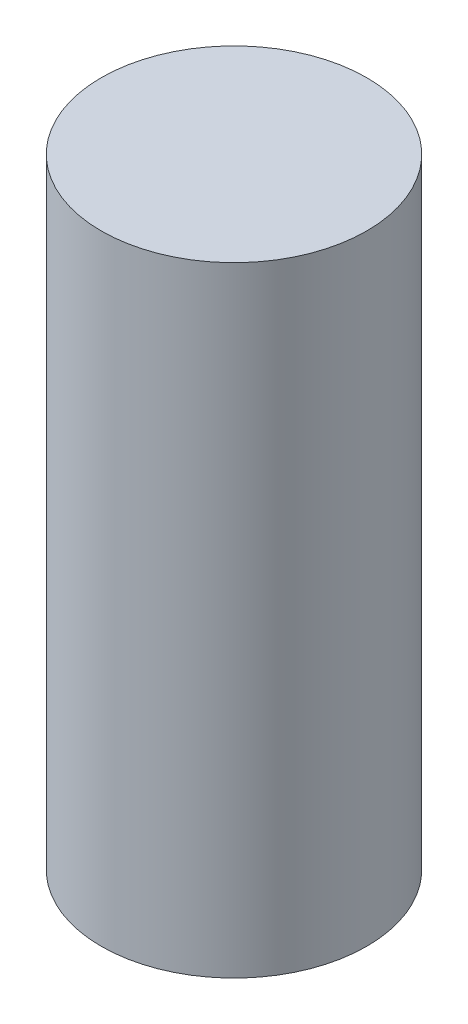
ISO-10303-21;
HEADER;
FILE_DESCRIPTION(('STEP AP214'),'2;1');
FILE_NAME('part.step','',(''),(''),'','','');
FILE_SCHEMA(('AUTOMOTIVE_DESIGN { 1 0 10303 214 1 1 1 1 }'));
ENDSEC;
DATA;
#1=APPLICATION_CONTEXT('core data for automotive mechanical design processes');
#2=APPLICATION_PROTOCOL_DEFINITION('international standard','automotive_design',2000,#1);
#3=PRODUCT_CONTEXT('',#1,'mechanical');
#4=PRODUCT('Part','Part','',(#3));
#5=PRODUCT_RELATED_PRODUCT_CATEGORY('part','',(#4));
#6=PRODUCT_DEFINITION_FORMATION('','',#4);
#7=PRODUCT_DEFINITION_CONTEXT('part definition',#1,'design');
#8=PRODUCT_DEFINITION('design','',#6,#7);
#9=PRODUCT_DEFINITION_SHAPE('','',#8);
#10=(LENGTH_UNIT() NAMED_UNIT(*) SI_UNIT(.MILLI.,.METRE.));
#11=(NAMED_UNIT(*) PLANE_ANGLE_UNIT() SI_UNIT($,.RADIAN.));
#12=(NAMED_UNIT(*) SI_UNIT($,.STERADIAN.) SOLID_ANGLE_UNIT());
#13=UNCERTAINTY_MEASURE_WITH_UNIT(LENGTH_MEASURE(1.E-05),#10,'distance_accuracy_value','');
#14=(GEOMETRIC_REPRESENTATION_CONTEXT(3) GLOBAL_UNCERTAINTY_ASSIGNED_CONTEXT((#13)) GLOBAL_UNIT_ASSIGNED_CONTEXT((#10,
#11,#12)) REPRESENTATION_CONTEXT('',''));
#15=CARTESIAN_POINT('',(0.,0.,0.));
#16=DIRECTION('',(0.,0.,1.));
#17=DIRECTION('',(1.,0.,0.));
#18=AXIS2_PLACEMENT_3D('',#15,#16,#17);
#19=CARTESIAN_POINT('',(0.,7.,0.));
#20=DIRECTION('',(0.,-1.,0.));
#21=DIRECTION('',(0.,0.,-1.));
#22=AXIS2_PLACEMENT_3D('',#19,#20,#21);
#23=CYLINDRICAL_SURFACE('',#22,1.5);
#24=CARTESIAN_POINT('',(0.,7.,0.));
#25=DIRECTION('',(0.,1.,0.));
#26=DIRECTION('',(0.,0.,1.));
#27=AXIS2_PLACEMENT_3D('',#24,#25,#26);
#28=CIRCLE('',#27,1.5);
#29=CARTESIAN_POINT('',(0.,7.,1.5));
#30=VERTEX_POINT('',#29);
#31=EDGE_CURVE('E10',#30,#30,#28,.T.);
#32=ORIENTED_EDGE('',*,*,#31,.F.);
#33=EDGE_LOOP('',(#32));
#34=FACE_BOUND('',#33,.T.);
#35=CARTESIAN_POINT('',(0.,0.,0.));
#36=DIRECTION('',(0.,1.,0.));
#37=DIRECTION('',(0.,0.,1.));
#38=AXIS2_PLACEMENT_3D('',#35,#36,#37);
#39=CIRCLE('',#38,1.5);
#40=CARTESIAN_POINT('',(0.,0.,1.5));
#41=VERTEX_POINT('',#40);
#42=EDGE_CURVE('E38',#41,#41,#39,.T.);
#43=ORIENTED_EDGE('',*,*,#42,.T.);
#44=EDGE_LOOP('',(#43));
#45=FACE_BOUND('',#44,.T.);
#46=ADVANCED_FACE('F35',(#34,#45),#23,.T.);
#47=CARTESIAN_POINT('',(0.,7.,0.));
#48=DIRECTION('',(0.,1.,0.));
#49=DIRECTION('',(0.,0.,1.));
#50=AXIS2_PLACEMENT_3D('',#47,#48,#49);
#51=PLANE('',#50);
#52=ORIENTED_EDGE('',*,*,#31,.T.);
#53=EDGE_LOOP('',(#52));
#54=FACE_BOUND('',#53,.T.);
#55=ADVANCED_FACE('F50',(#54),#51,.T.);
#56=CARTESIAN_POINT('',(0.,0.,0.));
#57=DIRECTION('',(0.,1.,0.));
#58=DIRECTION('',(0.,0.,1.));
#59=AXIS2_PLACEMENT_3D('',#56,#57,#58);
#60=PLANE('',#59);
#61=ORIENTED_EDGE('',*,*,#42,.F.);
#62=EDGE_LOOP('',(#61));
#63=FACE_BOUND('',#62,.T.);
#64=ADVANCED_FACE('F48',(#63),#60,.F.);
#65=CLOSED_SHELL('',(#46,#55,#64));
#66=MANIFOLD_SOLID_BREP('B2',#65);
#67=ADVANCED_BREP_SHAPE_REPRESENTATION('',(#18,#66),#14);
#68=SHAPE_DEFINITION_REPRESENTATION(#9,#67);
ENDSEC;
END-ISO-10303-21;
